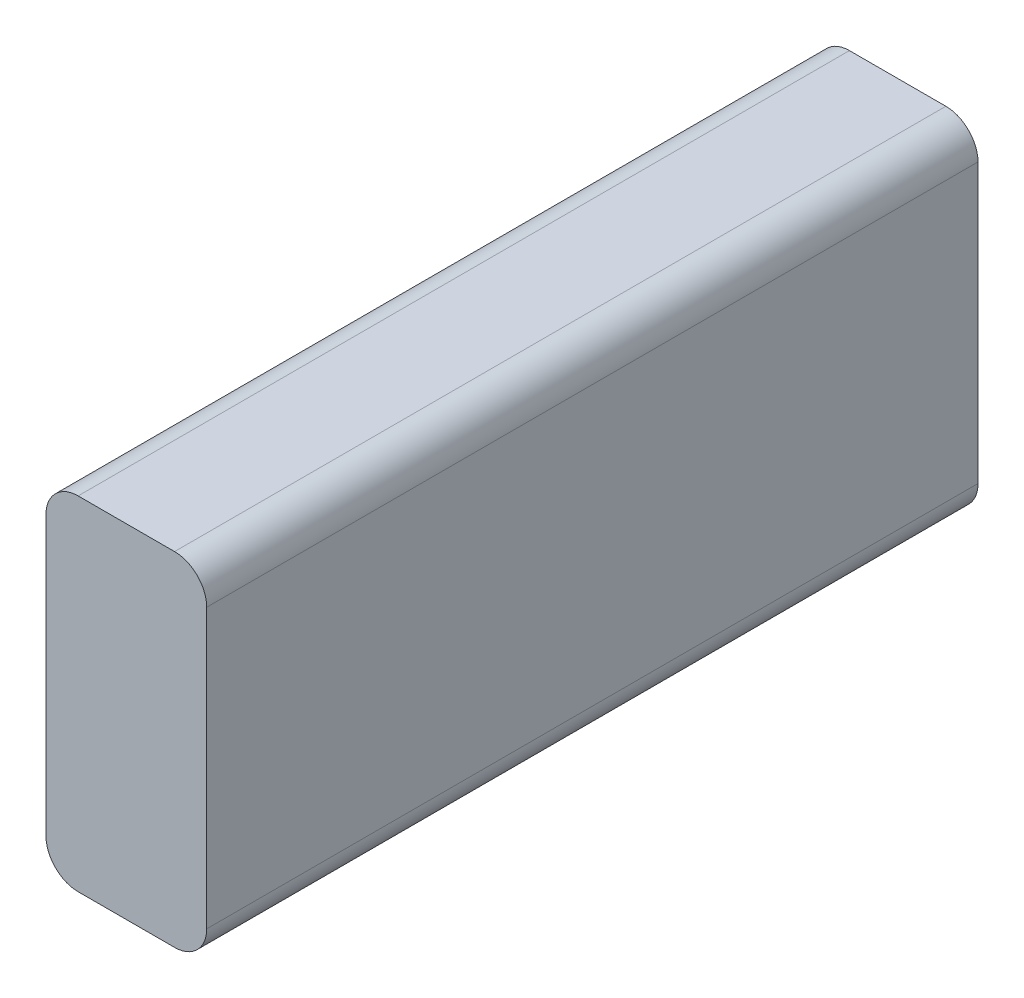
ISO-10303-21;
HEADER;
FILE_DESCRIPTION(('STEP AP214'),'2;1');
FILE_NAME('part.step','',(''),(''),'','','');
FILE_SCHEMA(('AUTOMOTIVE_DESIGN { 1 0 10303 214 1 1 1 1 }'));
ENDSEC;
DATA;
#1=APPLICATION_CONTEXT('core data for automotive mechanical design processes');
#2=APPLICATION_PROTOCOL_DEFINITION('international standard','automotive_design',2000,#1);
#3=PRODUCT_CONTEXT('',#1,'mechanical');
#4=PRODUCT('Part','Part','',(#3));
#5=PRODUCT_RELATED_PRODUCT_CATEGORY('part','',(#4));
#6=PRODUCT_DEFINITION_FORMATION('','',#4);
#7=PRODUCT_DEFINITION_CONTEXT('part definition',#1,'design');
#8=PRODUCT_DEFINITION('design','',#6,#7);
#9=PRODUCT_DEFINITION_SHAPE('','',#8);
#10=(LENGTH_UNIT() NAMED_UNIT(*) SI_UNIT(.MILLI.,.METRE.));
#11=(NAMED_UNIT(*) PLANE_ANGLE_UNIT() SI_UNIT($,.RADIAN.));
#12=(NAMED_UNIT(*) SI_UNIT($,.STERADIAN.) SOLID_ANGLE_UNIT());
#13=UNCERTAINTY_MEASURE_WITH_UNIT(LENGTH_MEASURE(1.E-05),#10,'distance_accuracy_value','');
#14=(GEOMETRIC_REPRESENTATION_CONTEXT(3) GLOBAL_UNCERTAINTY_ASSIGNED_CONTEXT((#13)) GLOBAL_UNIT_ASSIGNED_CONTEXT((#10,
#11,#12)) REPRESENTATION_CONTEXT('',''));
#15=CARTESIAN_POINT('',(0.,0.,0.));
#16=DIRECTION('',(0.,0.,1.));
#17=DIRECTION('',(1.,0.,0.));
#18=AXIS2_PLACEMENT_3D('',#15,#16,#17);
#19=CARTESIAN_POINT('',(-190.5,-406.4,1828.8));
#20=DIRECTION('',(1.,0.,0.));
#21=DIRECTION('',(0.,0.,-1.));
#22=AXIS2_PLACEMENT_3D('',#19,#20,#21);
#23=PLANE('',#22);
#24=DIRECTION('',(0.,-1.,0.));
#25=VECTOR('',#24,1.);
#26=CARTESIAN_POINT('',(-190.5,-406.4,0.));
#27=LINE('',#26,#25);
#28=CARTESIAN_POINT('',(-190.5,330.2,0.));
#29=VERTEX_POINT('',#28);
#30=CARTESIAN_POINT('',(-190.5,-330.2,0.));
#31=VERTEX_POINT('',#30);
#32=EDGE_CURVE('E149',#29,#31,#27,.T.);
#33=ORIENTED_EDGE('',*,*,#32,.T.);
#34=DIRECTION('',(0.,0.,-1.));
#35=VECTOR('',#34,1.);
#36=CARTESIAN_POINT('',(-190.5,-330.2,1828.8));
#37=LINE('',#36,#35);
#38=CARTESIAN_POINT('',(-190.5,-330.2,1828.8));
#39=VERTEX_POINT('',#38);
#40=EDGE_CURVE('E183',#31,#39,#37,.F.);
#41=ORIENTED_EDGE('',*,*,#40,.T.);
#42=DIRECTION('',(0.,-1.,0.));
#43=VECTOR('',#42,1.);
#44=CARTESIAN_POINT('',(-190.5,-406.4,1828.8));
#45=LINE('',#44,#43);
#46=CARTESIAN_POINT('',(-190.5,330.2,1828.8));
#47=VERTEX_POINT('',#46);
#48=EDGE_CURVE('E147',#47,#39,#45,.T.);
#49=ORIENTED_EDGE('',*,*,#48,.F.);
#50=DIRECTION('',(0.,0.,-1.));
#51=VECTOR('',#50,1.);
#52=CARTESIAN_POINT('',(-190.5,330.2,1828.8));
#53=LINE('',#52,#51);
#54=EDGE_CURVE('E179',#47,#29,#53,.T.);
#55=ORIENTED_EDGE('',*,*,#54,.T.);
#56=EDGE_LOOP('',(#33,#41,#49,#55));
#57=FACE_BOUND('',#56,.T.);
#58=ADVANCED_FACE('F48',(#57),#23,.F.);
#59=CARTESIAN_POINT('',(190.5,-406.4,1828.8));
#60=DIRECTION('',(0.,1.,0.));
#61=DIRECTION('',(0.,0.,1.));
#62=AXIS2_PLACEMENT_3D('',#59,#60,#61);
#63=PLANE('',#62);
#64=DIRECTION('',(1.,0.,0.));
#65=VECTOR('',#64,1.);
#66=CARTESIAN_POINT('',(190.5,-406.4,0.));
#67=LINE('',#66,#65);
#68=CARTESIAN_POINT('',(-114.3,-406.4,0.));
#69=VERTEX_POINT('',#68);
#70=CARTESIAN_POINT('',(114.3,-406.4,0.));
#71=VERTEX_POINT('',#70);
#72=EDGE_CURVE('E143',#69,#71,#67,.T.);
#73=ORIENTED_EDGE('',*,*,#72,.T.);
#74=DIRECTION('',(0.,0.,-1.));
#75=VECTOR('',#74,1.);
#76=CARTESIAN_POINT('',(114.3,-406.4,1828.8));
#77=LINE('',#76,#75);
#78=CARTESIAN_POINT('',(114.3,-406.4,1828.8));
#79=VERTEX_POINT('',#78);
#80=EDGE_CURVE('E119',#71,#79,#77,.F.);
#81=ORIENTED_EDGE('',*,*,#80,.T.);
#82=DIRECTION('',(1.,0.,0.));
#83=VECTOR('',#82,1.);
#84=CARTESIAN_POINT('',(190.5,-406.4,1828.8));
#85=LINE('',#84,#83);
#86=CARTESIAN_POINT('',(-114.3,-406.4,1828.8));
#87=VERTEX_POINT('',#86);
#88=EDGE_CURVE('E202',#87,#79,#85,.T.);
#89=ORIENTED_EDGE('',*,*,#88,.F.);
#90=DIRECTION('',(0.,0.,-1.));
#91=VECTOR('',#90,1.);
#92=CARTESIAN_POINT('',(-114.3,-406.4,1828.8));
#93=LINE('',#92,#91);
#94=EDGE_CURVE('E125',#87,#69,#93,.T.);
#95=ORIENTED_EDGE('',*,*,#94,.T.);
#96=EDGE_LOOP('',(#73,#81,#89,#95));
#97=FACE_BOUND('',#96,.T.);
#98=ADVANCED_FACE('F223',(#97),#63,.F.);
#99=CARTESIAN_POINT('',(190.5,-406.4,1828.8));
#100=DIRECTION('',(-1.,0.,0.));
#101=DIRECTION('',(0.,-1.,0.));
#102=AXIS2_PLACEMENT_3D('',#99,#100,#101);
#103=PLANE('',#102);
#104=DIRECTION('',(0.,1.,0.));
#105=VECTOR('',#104,1.);
#106=CARTESIAN_POINT('',(190.5,-406.4,1828.8));
#107=LINE('',#106,#105);
#108=CARTESIAN_POINT('',(190.5,-330.2,1828.8));
#109=VERTEX_POINT('',#108);
#110=CARTESIAN_POINT('',(190.5,330.2,1828.8));
#111=VERTEX_POINT('',#110);
#112=EDGE_CURVE('E134',#109,#111,#107,.T.);
#113=ORIENTED_EDGE('',*,*,#112,.F.);
#114=DIRECTION('',(0.,0.,-1.));
#115=VECTOR('',#114,1.);
#116=CARTESIAN_POINT('',(190.5,-330.2,1828.8));
#117=LINE('',#116,#115);
#118=CARTESIAN_POINT('',(190.5,-330.2,0.));
#119=VERTEX_POINT('',#118);
#120=EDGE_CURVE('E118',#109,#119,#117,.T.);
#121=ORIENTED_EDGE('',*,*,#120,.T.);
#122=DIRECTION('',(0.,1.,0.));
#123=VECTOR('',#122,1.);
#124=CARTESIAN_POINT('',(190.5,-406.4,0.));
#125=LINE('',#124,#123);
#126=CARTESIAN_POINT('',(190.5,330.2,0.));
#127=VERTEX_POINT('',#126);
#128=EDGE_CURVE('E132',#119,#127,#125,.T.);
#129=ORIENTED_EDGE('',*,*,#128,.T.);
#130=DIRECTION('',(0.,0.,-1.));
#131=VECTOR('',#130,1.);
#132=CARTESIAN_POINT('',(190.5,330.2,1828.8));
#133=LINE('',#132,#131);
#134=EDGE_CURVE('E137',#127,#111,#133,.F.);
#135=ORIENTED_EDGE('',*,*,#134,.T.);
#136=EDGE_LOOP('',(#113,#121,#129,#135));
#137=FACE_BOUND('',#136,.T.);
#138=ADVANCED_FACE('F131',(#137),#103,.F.);
#139=CARTESIAN_POINT('',(190.5,406.4,1828.8));
#140=DIRECTION('',(0.,-1.,0.));
#141=DIRECTION('',(0.,0.,-1.));
#142=AXIS2_PLACEMENT_3D('',#139,#140,#141);
#143=PLANE('',#142);
#144=DIRECTION('',(-1.,0.,0.));
#145=VECTOR('',#144,1.);
#146=CARTESIAN_POINT('',(190.5,406.4,0.));
#147=LINE('',#146,#145);
#148=CARTESIAN_POINT('',(114.3,406.4,0.));
#149=VERTEX_POINT('',#148);
#150=CARTESIAN_POINT('',(-114.3,406.4,0.));
#151=VERTEX_POINT('',#150);
#152=EDGE_CURVE('E142',#149,#151,#147,.T.);
#153=ORIENTED_EDGE('',*,*,#152,.T.);
#154=DIRECTION('',(0.,0.,-1.));
#155=VECTOR('',#154,1.);
#156=CARTESIAN_POINT('',(-114.3,406.4,1828.8));
#157=LINE('',#156,#155);
#158=CARTESIAN_POINT('',(-114.3,406.4,1828.8));
#159=VERTEX_POINT('',#158);
#160=EDGE_CURVE('E11',#151,#159,#157,.F.);
#161=ORIENTED_EDGE('',*,*,#160,.T.);
#162=DIRECTION('',(-1.,0.,0.));
#163=VECTOR('',#162,1.);
#164=CARTESIAN_POINT('',(190.5,406.4,1828.8));
#165=LINE('',#164,#163);
#166=CARTESIAN_POINT('',(114.3,406.4,1828.8));
#167=VERTEX_POINT('',#166);
#168=EDGE_CURVE('E154',#167,#159,#165,.T.);
#169=ORIENTED_EDGE('',*,*,#168,.F.);
#170=DIRECTION('',(0.,0.,-1.));
#171=VECTOR('',#170,1.);
#172=CARTESIAN_POINT('',(114.3,406.4,1828.8));
#173=LINE('',#172,#171);
#174=EDGE_CURVE('E57',#167,#149,#173,.T.);
#175=ORIENTED_EDGE('',*,*,#174,.T.);
#176=EDGE_LOOP('',(#153,#161,#169,#175));
#177=FACE_BOUND('',#176,.T.);
#178=ADVANCED_FACE('F188',(#177),#143,.F.);
#179=CARTESIAN_POINT('',(0.,0.,1828.8));
#180=DIRECTION('',(0.,0.,1.));
#181=DIRECTION('',(1.,0.,0.));
#182=AXIS2_PLACEMENT_3D('',#179,#180,#181);
#183=PLANE('',#182);
#184=ORIENTED_EDGE('',*,*,#88,.T.);
#185=CARTESIAN_POINT('',(114.3,-330.2,1828.8));
#186=DIRECTION('',(0.,0.,1.));
#187=DIRECTION('',(1.,0.,0.));
#188=AXIS2_PLACEMENT_3D('',#185,#186,#187);
#189=CIRCLE('',#188,76.2);
#190=EDGE_CURVE('E176',#79,#109,#189,.T.);
#191=ORIENTED_EDGE('',*,*,#190,.T.);
#192=ORIENTED_EDGE('',*,*,#112,.T.);
#193=CARTESIAN_POINT('',(114.3,330.2,1828.8));
#194=DIRECTION('',(0.,0.,1.));
#195=DIRECTION('',(1.,0.,0.));
#196=AXIS2_PLACEMENT_3D('',#193,#194,#195);
#197=CIRCLE('',#196,76.2);
#198=EDGE_CURVE('E69',#111,#167,#197,.T.);
#199=ORIENTED_EDGE('',*,*,#198,.T.);
#200=ORIENTED_EDGE('',*,*,#168,.T.);
#201=CARTESIAN_POINT('',(-114.3,330.2,1828.8));
#202=DIRECTION('',(0.,0.,1.));
#203=DIRECTION('',(1.,0.,0.));
#204=AXIS2_PLACEMENT_3D('',#201,#202,#203);
#205=CIRCLE('',#204,76.2);
#206=EDGE_CURVE('E170',#159,#47,#205,.T.);
#207=ORIENTED_EDGE('',*,*,#206,.T.);
#208=ORIENTED_EDGE('',*,*,#48,.T.);
#209=CARTESIAN_POINT('',(-114.3,-330.2,1828.8));
#210=DIRECTION('',(0.,0.,1.));
#211=DIRECTION('',(1.,0.,0.));
#212=AXIS2_PLACEMENT_3D('',#209,#210,#211);
#213=CIRCLE('',#212,76.2);
#214=EDGE_CURVE('E173',#39,#87,#213,.T.);
#215=ORIENTED_EDGE('',*,*,#214,.T.);
#216=EDGE_LOOP('',(#184,#191,#192,#199,#200,#207,#208,#215));
#217=FACE_BOUND('',#216,.T.);
#218=ADVANCED_FACE('F212',(#217),#183,.T.);
#219=CARTESIAN_POINT('',(0.,0.,0.));
#220=DIRECTION('',(0.,0.,1.));
#221=DIRECTION('',(1.,0.,0.));
#222=AXIS2_PLACEMENT_3D('',#219,#220,#221);
#223=PLANE('',#222);
#224=ORIENTED_EDGE('',*,*,#128,.F.);
#225=CARTESIAN_POINT('',(114.3,-330.2,0.));
#226=DIRECTION('',(0.,0.,1.));
#227=DIRECTION('',(1.,0.,0.));
#228=AXIS2_PLACEMENT_3D('',#225,#226,#227);
#229=CIRCLE('',#228,76.2);
#230=EDGE_CURVE('E114',#119,#71,#229,.F.);
#231=ORIENTED_EDGE('',*,*,#230,.T.);
#232=ORIENTED_EDGE('',*,*,#72,.F.);
#233=CARTESIAN_POINT('',(-114.3,-330.2,0.));
#234=DIRECTION('',(0.,0.,1.));
#235=DIRECTION('',(1.,0.,0.));
#236=AXIS2_PLACEMENT_3D('',#233,#234,#235);
#237=CIRCLE('',#236,76.2);
#238=EDGE_CURVE('E126',#69,#31,#237,.F.);
#239=ORIENTED_EDGE('',*,*,#238,.T.);
#240=ORIENTED_EDGE('',*,*,#32,.F.);
#241=CARTESIAN_POINT('',(-114.3,330.2,0.));
#242=DIRECTION('',(0.,0.,1.));
#243=DIRECTION('',(1.,0.,0.));
#244=AXIS2_PLACEMENT_3D('',#241,#242,#243);
#245=CIRCLE('',#244,76.2);
#246=EDGE_CURVE('E158',#29,#151,#245,.F.);
#247=ORIENTED_EDGE('',*,*,#246,.T.);
#248=ORIENTED_EDGE('',*,*,#152,.F.);
#249=CARTESIAN_POINT('',(114.3,330.2,0.));
#250=DIRECTION('',(0.,0.,1.));
#251=DIRECTION('',(1.,0.,0.));
#252=AXIS2_PLACEMENT_3D('',#249,#250,#251);
#253=CIRCLE('',#252,76.2);
#254=EDGE_CURVE('E136',#149,#127,#253,.F.);
#255=ORIENTED_EDGE('',*,*,#254,.T.);
#256=EDGE_LOOP('',(#224,#231,#232,#239,#240,#247,#248,#255));
#257=FACE_BOUND('',#256,.T.);
#258=ADVANCED_FACE('F139',(#257),#223,.F.);
#259=CARTESIAN_POINT('',(114.3,-330.2,1828.8));
#260=DIRECTION('',(0.,0.,-1.));
#261=DIRECTION('',(-1.,0.,0.));
#262=AXIS2_PLACEMENT_3D('',#259,#260,#261);
#263=CYLINDRICAL_SURFACE('',#262,76.2);
#264=ORIENTED_EDGE('',*,*,#190,.F.);
#265=ORIENTED_EDGE('',*,*,#80,.F.);
#266=ORIENTED_EDGE('',*,*,#230,.F.);
#267=ORIENTED_EDGE('',*,*,#120,.F.);
#268=EDGE_LOOP('',(#264,#265,#266,#267));
#269=FACE_BOUND('',#268,.T.);
#270=ADVANCED_FACE('F117',(#269),#263,.T.);
#271=CARTESIAN_POINT('',(-114.3,-330.2,1828.8));
#272=DIRECTION('',(0.,0.,-1.));
#273=DIRECTION('',(-1.,0.,0.));
#274=AXIS2_PLACEMENT_3D('',#271,#272,#273);
#275=CYLINDRICAL_SURFACE('',#274,76.2);
#276=ORIENTED_EDGE('',*,*,#214,.F.);
#277=ORIENTED_EDGE('',*,*,#40,.F.);
#278=ORIENTED_EDGE('',*,*,#238,.F.);
#279=ORIENTED_EDGE('',*,*,#94,.F.);
#280=EDGE_LOOP('',(#276,#277,#278,#279));
#281=FACE_BOUND('',#280,.T.);
#282=ADVANCED_FACE('F234',(#281),#275,.T.);
#283=CARTESIAN_POINT('',(-114.3,330.2,1828.8));
#284=DIRECTION('',(0.,0.,-1.));
#285=DIRECTION('',(-1.,0.,0.));
#286=AXIS2_PLACEMENT_3D('',#283,#284,#285);
#287=CYLINDRICAL_SURFACE('',#286,76.2);
#288=ORIENTED_EDGE('',*,*,#206,.F.);
#289=ORIENTED_EDGE('',*,*,#160,.F.);
#290=ORIENTED_EDGE('',*,*,#246,.F.);
#291=ORIENTED_EDGE('',*,*,#54,.F.);
#292=EDGE_LOOP('',(#288,#289,#290,#291));
#293=FACE_BOUND('',#292,.T.);
#294=ADVANCED_FACE('F195',(#293),#287,.T.);
#295=CARTESIAN_POINT('',(114.3,330.2,1828.8));
#296=DIRECTION('',(0.,0.,-1.));
#297=DIRECTION('',(-1.,0.,0.));
#298=AXIS2_PLACEMENT_3D('',#295,#296,#297);
#299=CYLINDRICAL_SURFACE('',#298,76.2);
#300=ORIENTED_EDGE('',*,*,#198,.F.);
#301=ORIENTED_EDGE('',*,*,#134,.F.);
#302=ORIENTED_EDGE('',*,*,#254,.F.);
#303=ORIENTED_EDGE('',*,*,#174,.F.);
#304=EDGE_LOOP('',(#300,#301,#302,#303));
#305=FACE_BOUND('',#304,.T.);
#306=ADVANCED_FACE('F50',(#305),#299,.T.);
#307=CLOSED_SHELL('',(#58,#98,#138,#178,#218,#258,#270,#282,#294,#306));
#308=MANIFOLD_SOLID_BREP('B2',#307);
#309=ADVANCED_BREP_SHAPE_REPRESENTATION('',(#18,#308),#14);
#310=SHAPE_DEFINITION_REPRESENTATION(#9,#309);
ENDSEC;
END-ISO-10303-21;
